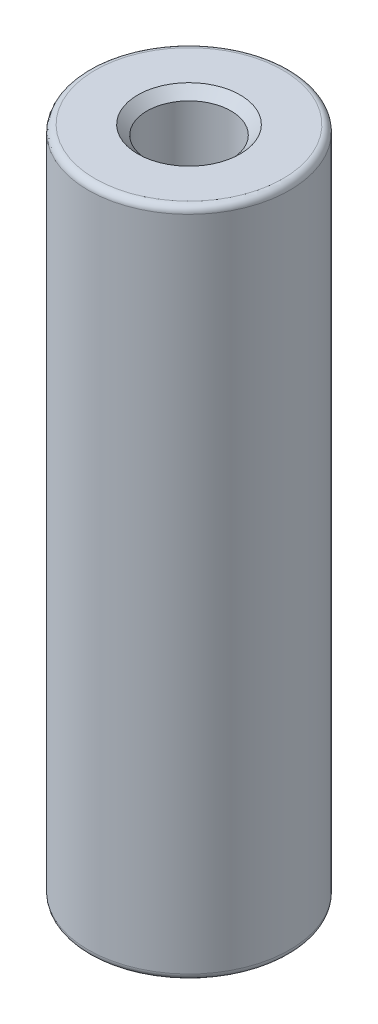
ISO-10303-21;
HEADER;
FILE_DESCRIPTION(('STEP AP214'),'2;1');
FILE_NAME('part.step','',(''),(''),'','','');
FILE_SCHEMA(('AUTOMOTIVE_DESIGN { 1 0 10303 214 1 1 1 1 }'));
ENDSEC;
DATA;
#1=APPLICATION_CONTEXT('core data for automotive mechanical design processes');
#2=APPLICATION_PROTOCOL_DEFINITION('international standard','automotive_design',2000,#1);
#3=PRODUCT_CONTEXT('',#1,'mechanical');
#4=PRODUCT('Part','Part','',(#3));
#5=PRODUCT_RELATED_PRODUCT_CATEGORY('part','',(#4));
#6=PRODUCT_DEFINITION_FORMATION('','',#4);
#7=PRODUCT_DEFINITION_CONTEXT('part definition',#1,'design');
#8=PRODUCT_DEFINITION('design','',#6,#7);
#9=PRODUCT_DEFINITION_SHAPE('','',#8);
#10=(LENGTH_UNIT() NAMED_UNIT(*) SI_UNIT(.MILLI.,.METRE.));
#11=(NAMED_UNIT(*) PLANE_ANGLE_UNIT() SI_UNIT($,.RADIAN.));
#12=(NAMED_UNIT(*) SI_UNIT($,.STERADIAN.) SOLID_ANGLE_UNIT());
#13=UNCERTAINTY_MEASURE_WITH_UNIT(LENGTH_MEASURE(1.E-05),#10,'distance_accuracy_value','');
#14=(GEOMETRIC_REPRESENTATION_CONTEXT(3) GLOBAL_UNCERTAINTY_ASSIGNED_CONTEXT((#13)) GLOBAL_UNIT_ASSIGNED_CONTEXT((#10,
#11,#12)) REPRESENTATION_CONTEXT('',''));
#15=CARTESIAN_POINT('',(0.,0.,0.));
#16=DIRECTION('',(0.,0.,1.));
#17=DIRECTION('',(1.,0.,0.));
#18=AXIS2_PLACEMENT_3D('',#15,#16,#17);
#19=CARTESIAN_POINT('',(0.,20.,0.));
#20=DIRECTION('',(0.,-1.,0.));
#21=DIRECTION('',(0.,0.,-1.));
#22=AXIS2_PLACEMENT_3D('',#19,#20,#21);
#23=CYLINDRICAL_SURFACE('',#22,3.);
#24=CARTESIAN_POINT('',(0.,0.199999999999999,0.));
#25=DIRECTION('',(0.,1.,0.));
#26=DIRECTION('',(0.,0.,1.));
#27=AXIS2_PLACEMENT_3D('',#24,#25,#26);
#28=CIRCLE('',#27,3.);
#29=CARTESIAN_POINT('',(0.,0.199999999999999,3.));
#30=VERTEX_POINT('',#29);
#31=EDGE_CURVE('E64',#30,#30,#28,.T.);
#32=ORIENTED_EDGE('',*,*,#31,.T.);
#33=EDGE_LOOP('',(#32));
#34=FACE_BOUND('',#33,.T.);
#35=CARTESIAN_POINT('',(0.,19.8,0.));
#36=DIRECTION('',(0.,1.,0.));
#37=DIRECTION('',(0.,0.,1.));
#38=AXIS2_PLACEMENT_3D('',#35,#36,#37);
#39=CIRCLE('',#38,3.);
#40=CARTESIAN_POINT('',(0.,19.8,3.));
#41=VERTEX_POINT('',#40);
#42=EDGE_CURVE('E69',#41,#41,#39,.F.);
#43=ORIENTED_EDGE('',*,*,#42,.T.);
#44=EDGE_LOOP('',(#43));
#45=FACE_BOUND('',#44,.T.);
#46=ADVANCED_FACE('F51',(#34,#45),#23,.T.);
#47=CARTESIAN_POINT('',(0.,20.,0.));
#48=DIRECTION('',(0.,1.,0.));
#49=DIRECTION('',(0.,0.,1.));
#50=AXIS2_PLACEMENT_3D('',#47,#48,#49);
#51=PLANE('',#50);
#52=CARTESIAN_POINT('',(0.,20.,0.));
#53=DIRECTION('',(0.,1.,0.));
#54=DIRECTION('',(0.,0.,1.));
#55=AXIS2_PLACEMENT_3D('',#52,#53,#54);
#56=CIRCLE('',#55,1.525);
#57=CARTESIAN_POINT('',(0.,20.,1.525));
#58=VERTEX_POINT('',#57);
#59=EDGE_CURVE('E80',#58,#58,#56,.T.);
#60=ORIENTED_EDGE('',*,*,#59,.F.);
#61=EDGE_LOOP('',(#60));
#62=FACE_BOUND('',#61,.T.);
#63=CARTESIAN_POINT('',(0.,20.,0.));
#64=DIRECTION('',(0.,1.,0.));
#65=DIRECTION('',(0.,0.,1.));
#66=AXIS2_PLACEMENT_3D('',#63,#64,#65);
#67=CIRCLE('',#66,2.8);
#68=CARTESIAN_POINT('',(0.,20.,2.8));
#69=VERTEX_POINT('',#68);
#70=EDGE_CURVE('E10',#69,#69,#67,.T.);
#71=ORIENTED_EDGE('',*,*,#70,.T.);
#72=EDGE_LOOP('',(#71));
#73=FACE_BOUND('',#72,.T.);
#74=ADVANCED_FACE('F107',(#62,#73),#51,.T.);
#75=CARTESIAN_POINT('',(0.,0.,0.));
#76=DIRECTION('',(0.,1.,0.));
#77=DIRECTION('',(0.,0.,1.));
#78=AXIS2_PLACEMENT_3D('',#75,#76,#77);
#79=PLANE('',#78);
#80=CARTESIAN_POINT('',(0.,0.,0.));
#81=DIRECTION('',(0.,1.,0.));
#82=DIRECTION('',(0.,0.,1.));
#83=AXIS2_PLACEMENT_3D('',#80,#81,#82);
#84=CIRCLE('',#83,1.52499999999999);
#85=CARTESIAN_POINT('',(0.,0.,1.52499999999999));
#86=VERTEX_POINT('',#85);
#87=EDGE_CURVE('E83',#86,#86,#84,.T.);
#88=ORIENTED_EDGE('',*,*,#87,.T.);
#89=EDGE_LOOP('',(#88));
#90=FACE_BOUND('',#89,.T.);
#91=CARTESIAN_POINT('',(0.,0.,0.));
#92=DIRECTION('',(0.,1.,0.));
#93=DIRECTION('',(0.,0.,1.));
#94=AXIS2_PLACEMENT_3D('',#91,#92,#93);
#95=CIRCLE('',#94,2.8);
#96=CARTESIAN_POINT('',(0.,0.,2.8));
#97=VERTEX_POINT('',#96);
#98=EDGE_CURVE('E59',#97,#97,#95,.F.);
#99=ORIENTED_EDGE('',*,*,#98,.T.);
#100=EDGE_LOOP('',(#99));
#101=FACE_BOUND('',#100,.T.);
#102=ADVANCED_FACE('F87',(#90,#101),#79,.F.);
#103=CARTESIAN_POINT('',(0.,0.199999999999999,0.));
#104=DIRECTION('',(0.,1.,0.));
#105=DIRECTION('',(0.,0.,1.));
#106=AXIS2_PLACEMENT_3D('',#103,#104,#105);
#107=TOROIDAL_SURFACE('',#106,2.8,0.2);
#108=ORIENTED_EDGE('',*,*,#98,.F.);
#109=EDGE_LOOP('',(#108));
#110=FACE_BOUND('',#109,.T.);
#111=ORIENTED_EDGE('',*,*,#31,.F.);
#112=EDGE_LOOP('',(#111));
#113=FACE_BOUND('',#112,.T.);
#114=ADVANCED_FACE('F113',(#110,#113),#107,.T.);
#115=CARTESIAN_POINT('',(0.,19.8,0.));
#116=DIRECTION('',(0.,1.,0.));
#117=DIRECTION('',(0.,0.,1.));
#118=AXIS2_PLACEMENT_3D('',#115,#116,#117);
#119=TOROIDAL_SURFACE('',#118,2.8,0.2);
#120=ORIENTED_EDGE('',*,*,#42,.F.);
#121=EDGE_LOOP('',(#120));
#122=FACE_BOUND('',#121,.T.);
#123=ORIENTED_EDGE('',*,*,#70,.F.);
#124=EDGE_LOOP('',(#123));
#125=FACE_BOUND('',#124,.T.);
#126=ADVANCED_FACE('F53',(#122,#125),#119,.T.);
#127=CARTESIAN_POINT('',(0.,0.274999999999997,0.));
#128=DIRECTION('',(0.,-1.,0.));
#129=DIRECTION('',(0.,0.,-1.));
#130=AXIS2_PLACEMENT_3D('',#127,#128,#129);
#131=CONICAL_SURFACE('',#130,1.25,0.785398163397448);
#132=ORIENTED_EDGE('',*,*,#87,.F.);
#133=EDGE_LOOP('',(#132));
#134=FACE_BOUND('',#133,.T.);
#135=CARTESIAN_POINT('',(0.,0.274999999999997,0.));
#136=DIRECTION('',(0.,1.,0.));
#137=DIRECTION('',(0.,0.,1.));
#138=AXIS2_PLACEMENT_3D('',#135,#136,#137);
#139=CIRCLE('',#138,1.25);
#140=CARTESIAN_POINT('',(0.,0.274999999999997,1.25));
#141=VERTEX_POINT('',#140);
#142=EDGE_CURVE('E74',#141,#141,#139,.T.);
#143=ORIENTED_EDGE('',*,*,#142,.T.);
#144=EDGE_LOOP('',(#143));
#145=FACE_BOUND('',#144,.T.);
#146=ADVANCED_FACE('F89',(#134,#145),#131,.F.);
#147=CARTESIAN_POINT('',(0.,20.,0.));
#148=DIRECTION('',(0.,1.,0.));
#149=DIRECTION('',(0.,0.,1.));
#150=AXIS2_PLACEMENT_3D('',#147,#148,#149);
#151=CYLINDRICAL_SURFACE('',#150,1.25);
#152=ORIENTED_EDGE('',*,*,#142,.F.);
#153=EDGE_LOOP('',(#152));
#154=FACE_BOUND('',#153,.T.);
#155=CARTESIAN_POINT('',(0.,19.725,0.));
#156=DIRECTION('',(0.,1.,0.));
#157=DIRECTION('',(0.,0.,1.));
#158=AXIS2_PLACEMENT_3D('',#155,#156,#157);
#159=CIRCLE('',#158,1.25);
#160=CARTESIAN_POINT('',(0.,19.725,1.25));
#161=VERTEX_POINT('',#160);
#162=EDGE_CURVE('E77',#161,#161,#159,.T.);
#163=ORIENTED_EDGE('',*,*,#162,.T.);
#164=EDGE_LOOP('',(#163));
#165=FACE_BOUND('',#164,.T.);
#166=ADVANCED_FACE('F92',(#154,#165),#151,.F.);
#167=CARTESIAN_POINT('',(0.,20.,0.));
#168=DIRECTION('',(0.,1.,0.));
#169=DIRECTION('',(0.,0.,1.));
#170=AXIS2_PLACEMENT_3D('',#167,#168,#169);
#171=CONICAL_SURFACE('',#170,1.525,0.785398163397447);
#172=ORIENTED_EDGE('',*,*,#162,.F.);
#173=EDGE_LOOP('',(#172));
#174=FACE_BOUND('',#173,.T.);
#175=ORIENTED_EDGE('',*,*,#59,.T.);
#176=EDGE_LOOP('',(#175));
#177=FACE_BOUND('',#176,.T.);
#178=ADVANCED_FACE('F98',(#174,#177),#171,.F.);
#179=CLOSED_SHELL('',(#46,#74,#102,#114,#126,#146,#166,#178));
#180=MANIFOLD_SOLID_BREP('B2',#179);
#181=ADVANCED_BREP_SHAPE_REPRESENTATION('',(#18,#180),#14);
#182=SHAPE_DEFINITION_REPRESENTATION(#9,#181);
ENDSEC;
END-ISO-10303-21;
